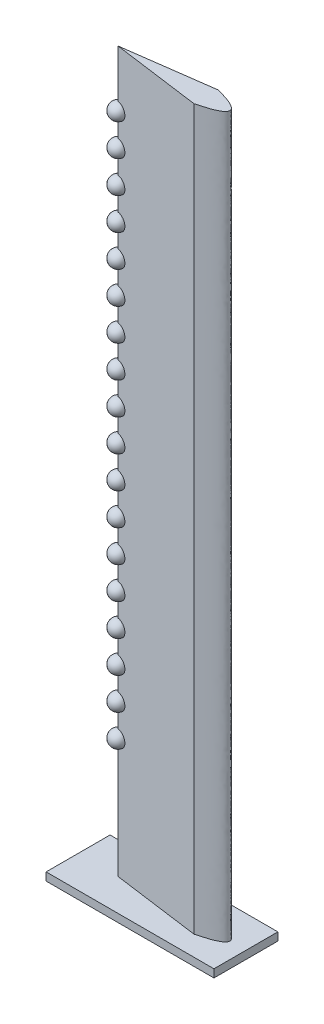
ISO-10303-21;
HEADER;
FILE_DESCRIPTION(('STEP AP214'),'2;1');
FILE_NAME('part.step','',(''),(''),'','','');
FILE_SCHEMA(('AUTOMOTIVE_DESIGN { 1 0 10303 214 1 1 1 1 }'));
ENDSEC;
DATA;
#1=APPLICATION_CONTEXT('core data for automotive mechanical design processes');
#2=APPLICATION_PROTOCOL_DEFINITION('international standard','automotive_design',2000,#1);
#3=PRODUCT_CONTEXT('',#1,'mechanical');
#4=PRODUCT('Part','Part','',(#3));
#5=PRODUCT_RELATED_PRODUCT_CATEGORY('part','',(#4));
#6=PRODUCT_DEFINITION_FORMATION('','',#4);
#7=PRODUCT_DEFINITION_CONTEXT('part definition',#1,'design');
#8=PRODUCT_DEFINITION('design','',#6,#7);
#9=PRODUCT_DEFINITION_SHAPE('','',#8);
#10=(LENGTH_UNIT() NAMED_UNIT(*) SI_UNIT(.MILLI.,.METRE.));
#11=(NAMED_UNIT(*) PLANE_ANGLE_UNIT() SI_UNIT($,.RADIAN.));
#12=(NAMED_UNIT(*) SI_UNIT($,.STERADIAN.) SOLID_ANGLE_UNIT());
#13=UNCERTAINTY_MEASURE_WITH_UNIT(LENGTH_MEASURE(1.E-05),#10,'distance_accuracy_value','');
#14=(GEOMETRIC_REPRESENTATION_CONTEXT(3) GLOBAL_UNCERTAINTY_ASSIGNED_CONTEXT((#13)) GLOBAL_UNIT_ASSIGNED_CONTEXT((#10,
#11,#12)) REPRESENTATION_CONTEXT('',''));
#15=CARTESIAN_POINT('',(0.,0.,0.));
#16=DIRECTION('',(0.,0.,1.));
#17=DIRECTION('',(1.,0.,0.));
#18=AXIS2_PLACEMENT_3D('',#15,#16,#17);
#19=CARTESIAN_POINT('',(110.,900.,15.));
#20=DIRECTION('',(0.135113204733314,0.,-0.990830168044299));
#21=DIRECTION('',(-0.990830168044299,0.,-0.135113204733313));
#22=AXIS2_PLACEMENT_3D('',#19,#20,#21);
#23=PLANE('',#22);
#24=DIRECTION('',(0.,-1.,0.));
#25=VECTOR('',#24,1.);
#26=CARTESIAN_POINT('',(0.,900.,0.));
#27=LINE('',#26,#25);
#28=CARTESIAN_POINT('',(0.,900.,0.));
#29=VERTEX_POINT('',#28);
#30=CARTESIAN_POINT('',(0.,840.,0.));
#31=VERTEX_POINT('',#30);
#32=EDGE_CURVE('E216',#29,#31,#27,.T.);
#33=ORIENTED_EDGE('',*,*,#32,.T.);
#34=CARTESIAN_POINT('',(0.,830.,0.));
#35=DIRECTION('',(0.135113204733314,0.,-0.990830168044299));
#36=DIRECTION('',(-0.990830168044299,0.,-0.135113204733313));
#37=AXIS2_PLACEMENT_3D('',#34,#35,#36);
#38=CIRCLE('',#37,10.);
#39=CARTESIAN_POINT('',(0.,820.,0.));
#40=VERTEX_POINT('',#39);
#41=EDGE_CURVE('E61',#31,#40,#38,.T.);
#42=ORIENTED_EDGE('',*,*,#41,.T.);
#43=CARTESIAN_POINT('',(0.,800.,0.));
#44=VERTEX_POINT('',#43);
#45=EDGE_CURVE('E67',#40,#44,#27,.T.);
#46=ORIENTED_EDGE('',*,*,#45,.T.);
#47=CARTESIAN_POINT('',(0.,790.,0.));
#48=DIRECTION('',(0.135113204733314,0.,-0.990830168044299));
#49=DIRECTION('',(-0.990830168044299,0.,-0.135113204733313));
#50=AXIS2_PLACEMENT_3D('',#47,#48,#49);
#51=CIRCLE('',#50,10.);
#52=CARTESIAN_POINT('',(0.,780.,0.));
#53=VERTEX_POINT('',#52);
#54=EDGE_CURVE('E218',#44,#53,#51,.T.);
#55=ORIENTED_EDGE('',*,*,#54,.T.);
#56=CARTESIAN_POINT('',(0.,760.,0.));
#57=VERTEX_POINT('',#56);
#58=EDGE_CURVE('E224',#53,#57,#27,.T.);
#59=ORIENTED_EDGE('',*,*,#58,.T.);
#60=CARTESIAN_POINT('',(0.,750.,0.));
#61=DIRECTION('',(0.135113204733314,0.,-0.990830168044299));
#62=DIRECTION('',(-0.990830168044299,0.,-0.135113204733313));
#63=AXIS2_PLACEMENT_3D('',#60,#61,#62);
#64=CIRCLE('',#63,10.);
#65=CARTESIAN_POINT('',(0.,740.,0.));
#66=VERTEX_POINT('',#65);
#67=EDGE_CURVE('E311',#57,#66,#64,.T.);
#68=ORIENTED_EDGE('',*,*,#67,.T.);
#69=CARTESIAN_POINT('',(0.,720.,0.));
#70=VERTEX_POINT('',#69);
#71=EDGE_CURVE('E230',#66,#70,#27,.T.);
#72=ORIENTED_EDGE('',*,*,#71,.T.);
#73=CARTESIAN_POINT('',(0.,710.,0.));
#74=DIRECTION('',(0.135113204733314,0.,-0.990830168044299));
#75=DIRECTION('',(-0.990830168044299,0.,-0.135113204733313));
#76=AXIS2_PLACEMENT_3D('',#73,#74,#75);
#77=CIRCLE('',#76,10.);
#78=CARTESIAN_POINT('',(0.,700.,0.));
#79=VERTEX_POINT('',#78);
#80=EDGE_CURVE('E315',#70,#79,#77,.T.);
#81=ORIENTED_EDGE('',*,*,#80,.T.);
#82=CARTESIAN_POINT('',(0.,680.,0.));
#83=VERTEX_POINT('',#82);
#84=EDGE_CURVE('E707',#79,#83,#27,.T.);
#85=ORIENTED_EDGE('',*,*,#84,.T.);
#86=CARTESIAN_POINT('',(0.,670.,0.));
#87=DIRECTION('',(0.135113204733314,0.,-0.990830168044299));
#88=DIRECTION('',(-0.990830168044299,0.,-0.135113204733313));
#89=AXIS2_PLACEMENT_3D('',#86,#87,#88);
#90=CIRCLE('',#89,10.);
#91=CARTESIAN_POINT('',(0.,660.,0.));
#92=VERTEX_POINT('',#91);
#93=EDGE_CURVE('E319',#83,#92,#90,.T.);
#94=ORIENTED_EDGE('',*,*,#93,.T.);
#95=CARTESIAN_POINT('',(0.,640.,0.));
#96=VERTEX_POINT('',#95);
#97=EDGE_CURVE('E711',#92,#96,#27,.T.);
#98=ORIENTED_EDGE('',*,*,#97,.T.);
#99=CARTESIAN_POINT('',(0.,630.,0.));
#100=DIRECTION('',(0.135113204733314,0.,-0.990830168044299));
#101=DIRECTION('',(-0.990830168044299,0.,-0.135113204733313));
#102=AXIS2_PLACEMENT_3D('',#99,#100,#101);
#103=CIRCLE('',#102,10.);
#104=CARTESIAN_POINT('',(0.,620.,0.));
#105=VERTEX_POINT('',#104);
#106=EDGE_CURVE('E326',#96,#105,#103,.T.);
#107=ORIENTED_EDGE('',*,*,#106,.T.);
#108=CARTESIAN_POINT('',(0.,600.,0.));
#109=VERTEX_POINT('',#108);
#110=EDGE_CURVE('E714',#105,#109,#27,.T.);
#111=ORIENTED_EDGE('',*,*,#110,.T.);
#112=CARTESIAN_POINT('',(0.,590.,0.));
#113=DIRECTION('',(0.135113204733314,0.,-0.990830168044299));
#114=DIRECTION('',(-0.990830168044299,0.,-0.135113204733313));
#115=AXIS2_PLACEMENT_3D('',#112,#113,#114);
#116=CIRCLE('',#115,10.);
#117=CARTESIAN_POINT('',(0.,580.,0.));
#118=VERTEX_POINT('',#117);
#119=EDGE_CURVE('E330',#109,#118,#116,.T.);
#120=ORIENTED_EDGE('',*,*,#119,.T.);
#121=CARTESIAN_POINT('',(0.,560.,0.));
#122=VERTEX_POINT('',#121);
#123=EDGE_CURVE('E717',#118,#122,#27,.T.);
#124=ORIENTED_EDGE('',*,*,#123,.T.);
#125=CARTESIAN_POINT('',(0.,550.,0.));
#126=DIRECTION('',(0.135113204733314,0.,-0.990830168044299));
#127=DIRECTION('',(-0.990830168044299,0.,-0.135113204733313));
#128=AXIS2_PLACEMENT_3D('',#125,#126,#127);
#129=CIRCLE('',#128,10.);
#130=CARTESIAN_POINT('',(0.,540.,0.));
#131=VERTEX_POINT('',#130);
#132=EDGE_CURVE('E334',#122,#131,#129,.T.);
#133=ORIENTED_EDGE('',*,*,#132,.T.);
#134=CARTESIAN_POINT('',(0.,520.,0.));
#135=VERTEX_POINT('',#134);
#136=EDGE_CURVE('E721',#131,#135,#27,.T.);
#137=ORIENTED_EDGE('',*,*,#136,.T.);
#138=CARTESIAN_POINT('',(0.,510.,0.));
#139=DIRECTION('',(0.135113204733314,0.,-0.990830168044299));
#140=DIRECTION('',(-0.990830168044299,0.,-0.135113204733313));
#141=AXIS2_PLACEMENT_3D('',#138,#139,#140);
#142=CIRCLE('',#141,10.);
#143=CARTESIAN_POINT('',(0.,500.,0.));
#144=VERTEX_POINT('',#143);
#145=EDGE_CURVE('E338',#135,#144,#142,.T.);
#146=ORIENTED_EDGE('',*,*,#145,.T.);
#147=CARTESIAN_POINT('',(0.,480.,0.));
#148=VERTEX_POINT('',#147);
#149=EDGE_CURVE('E725',#144,#148,#27,.T.);
#150=ORIENTED_EDGE('',*,*,#149,.T.);
#151=CARTESIAN_POINT('',(0.,470.,0.));
#152=DIRECTION('',(0.135113204733314,0.,-0.990830168044299));
#153=DIRECTION('',(-0.990830168044299,0.,-0.135113204733313));
#154=AXIS2_PLACEMENT_3D('',#151,#152,#153);
#155=CIRCLE('',#154,10.);
#156=CARTESIAN_POINT('',(0.,460.,0.));
#157=VERTEX_POINT('',#156);
#158=EDGE_CURVE('E342',#148,#157,#155,.T.);
#159=ORIENTED_EDGE('',*,*,#158,.T.);
#160=CARTESIAN_POINT('',(0.,440.,0.));
#161=VERTEX_POINT('',#160);
#162=EDGE_CURVE('E729',#157,#161,#27,.T.);
#163=ORIENTED_EDGE('',*,*,#162,.T.);
#164=CARTESIAN_POINT('',(0.,430.,0.));
#165=DIRECTION('',(0.135113204733314,0.,-0.990830168044299));
#166=DIRECTION('',(-0.990830168044299,0.,-0.135113204733313));
#167=AXIS2_PLACEMENT_3D('',#164,#165,#166);
#168=CIRCLE('',#167,10.);
#169=CARTESIAN_POINT('',(0.,420.,0.));
#170=VERTEX_POINT('',#169);
#171=EDGE_CURVE('E346',#161,#170,#168,.T.);
#172=ORIENTED_EDGE('',*,*,#171,.T.);
#173=CARTESIAN_POINT('',(0.,400.,0.));
#174=VERTEX_POINT('',#173);
#175=EDGE_CURVE('E733',#170,#174,#27,.T.);
#176=ORIENTED_EDGE('',*,*,#175,.T.);
#177=CARTESIAN_POINT('',(0.,390.,0.));
#178=DIRECTION('',(0.135113204733314,0.,-0.990830168044299));
#179=DIRECTION('',(-0.990830168044299,0.,-0.135113204733313));
#180=AXIS2_PLACEMENT_3D('',#177,#178,#179);
#181=CIRCLE('',#180,10.);
#182=CARTESIAN_POINT('',(0.,380.,0.));
#183=VERTEX_POINT('',#182);
#184=EDGE_CURVE('E350',#174,#183,#181,.T.);
#185=ORIENTED_EDGE('',*,*,#184,.T.);
#186=CARTESIAN_POINT('',(0.,360.,0.));
#187=VERTEX_POINT('',#186);
#188=EDGE_CURVE('E737',#183,#187,#27,.T.);
#189=ORIENTED_EDGE('',*,*,#188,.T.);
#190=CARTESIAN_POINT('',(0.,350.,0.));
#191=DIRECTION('',(0.135113204733314,0.,-0.990830168044299));
#192=DIRECTION('',(-0.990830168044299,0.,-0.135113204733313));
#193=AXIS2_PLACEMENT_3D('',#190,#191,#192);
#194=CIRCLE('',#193,10.);
#195=CARTESIAN_POINT('',(0.,340.,0.));
#196=VERTEX_POINT('',#195);
#197=EDGE_CURVE('E354',#187,#196,#194,.T.);
#198=ORIENTED_EDGE('',*,*,#197,.T.);
#199=CARTESIAN_POINT('',(0.,320.,0.));
#200=VERTEX_POINT('',#199);
#201=EDGE_CURVE('E741',#196,#200,#27,.T.);
#202=ORIENTED_EDGE('',*,*,#201,.T.);
#203=CARTESIAN_POINT('',(0.,310.,0.));
#204=DIRECTION('',(0.135113204733314,0.,-0.990830168044299));
#205=DIRECTION('',(-0.990830168044299,0.,-0.135113204733313));
#206=AXIS2_PLACEMENT_3D('',#203,#204,#205);
#207=CIRCLE('',#206,10.);
#208=CARTESIAN_POINT('',(0.,300.,0.));
#209=VERTEX_POINT('',#208);
#210=EDGE_CURVE('E358',#200,#209,#207,.T.);
#211=ORIENTED_EDGE('',*,*,#210,.T.);
#212=CARTESIAN_POINT('',(0.,280.,0.));
#213=VERTEX_POINT('',#212);
#214=EDGE_CURVE('E745',#209,#213,#27,.T.);
#215=ORIENTED_EDGE('',*,*,#214,.T.);
#216=CARTESIAN_POINT('',(0.,270.,0.));
#217=DIRECTION('',(0.135113204733314,0.,-0.990830168044299));
#218=DIRECTION('',(-0.990830168044299,0.,-0.135113204733313));
#219=AXIS2_PLACEMENT_3D('',#216,#217,#218);
#220=CIRCLE('',#219,10.);
#221=CARTESIAN_POINT('',(0.,260.,0.));
#222=VERTEX_POINT('',#221);
#223=EDGE_CURVE('E362',#213,#222,#220,.T.);
#224=ORIENTED_EDGE('',*,*,#223,.T.);
#225=CARTESIAN_POINT('',(0.,240.,0.));
#226=VERTEX_POINT('',#225);
#227=EDGE_CURVE('E749',#222,#226,#27,.T.);
#228=ORIENTED_EDGE('',*,*,#227,.T.);
#229=CARTESIAN_POINT('',(0.,230.,0.));
#230=DIRECTION('',(0.135113204733314,0.,-0.990830168044299));
#231=DIRECTION('',(-0.990830168044299,0.,-0.135113204733313));
#232=AXIS2_PLACEMENT_3D('',#229,#230,#231);
#233=CIRCLE('',#232,10.);
#234=CARTESIAN_POINT('',(0.,220.,0.));
#235=VERTEX_POINT('',#234);
#236=EDGE_CURVE('E366',#226,#235,#233,.T.);
#237=ORIENTED_EDGE('',*,*,#236,.T.);
#238=CARTESIAN_POINT('',(0.,200.,0.));
#239=VERTEX_POINT('',#238);
#240=EDGE_CURVE('E753',#235,#239,#27,.T.);
#241=ORIENTED_EDGE('',*,*,#240,.T.);
#242=CARTESIAN_POINT('',(0.,190.,0.));
#243=DIRECTION('',(0.135113204733314,0.,-0.990830168044299));
#244=DIRECTION('',(-0.990830168044299,0.,-0.135113204733313));
#245=AXIS2_PLACEMENT_3D('',#242,#243,#244);
#246=CIRCLE('',#245,10.);
#247=CARTESIAN_POINT('',(0.,180.,0.));
#248=VERTEX_POINT('',#247);
#249=EDGE_CURVE('E370',#239,#248,#246,.T.);
#250=ORIENTED_EDGE('',*,*,#249,.T.);
#251=CARTESIAN_POINT('',(0.,160.,0.));
#252=VERTEX_POINT('',#251);
#253=EDGE_CURVE('E757',#248,#252,#27,.T.);
#254=ORIENTED_EDGE('',*,*,#253,.T.);
#255=CARTESIAN_POINT('',(0.,150.,0.));
#256=DIRECTION('',(0.135113204733314,0.,-0.990830168044299));
#257=DIRECTION('',(-0.990830168044299,0.,-0.135113204733313));
#258=AXIS2_PLACEMENT_3D('',#255,#256,#257);
#259=CIRCLE('',#258,10.);
#260=CARTESIAN_POINT('',(0.,140.,0.));
#261=VERTEX_POINT('',#260);
#262=EDGE_CURVE('E374',#252,#261,#259,.T.);
#263=ORIENTED_EDGE('',*,*,#262,.T.);
#264=CARTESIAN_POINT('',(0.,0.,0.));
#265=VERTEX_POINT('',#264);
#266=EDGE_CURVE('E229',#261,#265,#27,.T.);
#267=ORIENTED_EDGE('',*,*,#266,.T.);
#268=DIRECTION('',(0.990830168044299,0.,0.135113204733313));
#269=VECTOR('',#268,1.);
#270=CARTESIAN_POINT('',(110.,0.,15.));
#271=LINE('',#270,#269);
#272=CARTESIAN_POINT('',(110.,0.,15.));
#273=VERTEX_POINT('',#272);
#274=EDGE_CURVE('E420',#265,#273,#271,.T.);
#275=ORIENTED_EDGE('',*,*,#274,.T.);
#276=DIRECTION('',(0.,-1.,0.));
#277=VECTOR('',#276,1.);
#278=CARTESIAN_POINT('',(110.,900.,15.));
#279=LINE('',#278,#277);
#280=CARTESIAN_POINT('',(110.,900.,15.));
#281=VERTEX_POINT('',#280);
#282=EDGE_CURVE('E238',#281,#273,#279,.T.);
#283=ORIENTED_EDGE('',*,*,#282,.F.);
#284=DIRECTION('',(0.990830168044299,0.,0.135113204733313));
#285=VECTOR('',#284,1.);
#286=CARTESIAN_POINT('',(110.,900.,15.));
#287=LINE('',#286,#285);
#288=EDGE_CURVE('E421',#29,#281,#287,.T.);
#289=ORIENTED_EDGE('',*,*,#288,.F.);
#290=EDGE_LOOP('',(#33,#42,#46,#55,#59,#68,#72,#81,#85,#94,#98,#107,#111,#120,#124,#133,#137,
#146,#150,#159,#163,#172,#176,#185,#189,#198,#202,#211,#215,#224,#228,#237,#241,#250,#254,#263,
#267,#275,#283,#289));
#291=FACE_BOUND('',#290,.T.);
#292=ADVANCED_FACE('F47',(#291),#23,.F.);
#293=CARTESIAN_POINT('',(110.,900.,15.));
#294=CARTESIAN_POINT('',(170.,900.,0.));
#295=CARTESIAN_POINT('',(110.,900.,-15.));
#296=B_SPLINE_CURVE_WITH_KNOTS('',2,(#293,#294,#295),.UNSPECIFIED.,.F.,.F.,(3,3),(0.,1.),.UNSPECIFIED.);
#297=DIRECTION('',(0.,-1.,0.));
#298=VECTOR('',#297,1.);
#299=SURFACE_OF_LINEAR_EXTRUSION('',#296,#298);
#300=CARTESIAN_POINT('',(110.,0.,15.));
#301=CARTESIAN_POINT('',(170.,0.,0.));
#302=CARTESIAN_POINT('',(110.,0.,-15.));
#303=B_SPLINE_CURVE_WITH_KNOTS('',2,(#300,#301,#302),.UNSPECIFIED.,.F.,.F.,(3,3),(0.,1.),.UNSPECIFIED.);
#304=CARTESIAN_POINT('',(110.,0.,-15.));
#305=VERTEX_POINT('',#304);
#306=EDGE_CURVE('E772',#273,#305,#303,.T.);
#307=ORIENTED_EDGE('',*,*,#306,.T.);
#308=DIRECTION('',(0.,-1.,0.));
#309=VECTOR('',#308,1.);
#310=CARTESIAN_POINT('',(110.,900.,-15.));
#311=LINE('',#310,#309);
#312=CARTESIAN_POINT('',(110.,900.,-15.));
#313=VERTEX_POINT('',#312);
#314=EDGE_CURVE('E228',#313,#305,#311,.T.);
#315=ORIENTED_EDGE('',*,*,#314,.F.);
#316=EDGE_CURVE('E425',#281,#313,#296,.T.);
#317=ORIENTED_EDGE('',*,*,#316,.F.);
#318=ORIENTED_EDGE('',*,*,#282,.T.);
#319=EDGE_LOOP('',(#307,#315,#317,#318));
#320=FACE_BOUND('',#319,.T.);
#321=ADVANCED_FACE('F436',(#320),#299,.F.);
#322=CARTESIAN_POINT('',(0.,900.,0.));
#323=DIRECTION('',(0.135113204733314,0.,0.990830168044299));
#324=DIRECTION('',(0.990830168044299,0.,-0.135113204733313));
#325=AXIS2_PLACEMENT_3D('',#322,#323,#324);
#326=PLANE('',#325);
#327=ORIENTED_EDGE('',*,*,#45,.F.);
#328=CARTESIAN_POINT('',(0.,830.,0.));
#329=DIRECTION('',(0.135113204733314,0.,0.990830168044299));
#330=DIRECTION('',(0.990830168044299,0.,-0.135113204733313));
#331=AXIS2_PLACEMENT_3D('',#328,#329,#330);
#332=CIRCLE('',#331,10.);
#333=EDGE_CURVE('E11',#40,#31,#332,.T.);
#334=ORIENTED_EDGE('',*,*,#333,.T.);
#335=ORIENTED_EDGE('',*,*,#32,.F.);
#336=DIRECTION('',(-0.990830168044299,0.,0.135113204733313));
#337=VECTOR('',#336,1.);
#338=CARTESIAN_POINT('',(0.,900.,0.));
#339=LINE('',#338,#337);
#340=EDGE_CURVE('E431',#313,#29,#339,.T.);
#341=ORIENTED_EDGE('',*,*,#340,.F.);
#342=ORIENTED_EDGE('',*,*,#314,.T.);
#343=DIRECTION('',(-0.990830168044299,0.,0.135113204733313));
#344=VECTOR('',#343,1.);
#345=CARTESIAN_POINT('',(0.,0.,0.));
#346=LINE('',#345,#344);
#347=EDGE_CURVE('E233',#305,#265,#346,.T.);
#348=ORIENTED_EDGE('',*,*,#347,.T.);
#349=ORIENTED_EDGE('',*,*,#266,.F.);
#350=CARTESIAN_POINT('',(0.,150.,0.));
#351=DIRECTION('',(0.135113204733314,0.,0.990830168044299));
#352=DIRECTION('',(0.990830168044299,0.,-0.135113204733313));
#353=AXIS2_PLACEMENT_3D('',#350,#351,#352);
#354=CIRCLE('',#353,10.);
#355=EDGE_CURVE('E242',#261,#252,#354,.T.);
#356=ORIENTED_EDGE('',*,*,#355,.T.);
#357=ORIENTED_EDGE('',*,*,#253,.F.);
#358=CARTESIAN_POINT('',(0.,190.,0.));
#359=DIRECTION('',(0.135113204733314,0.,0.990830168044299));
#360=DIRECTION('',(0.990830168044299,0.,-0.135113204733313));
#361=AXIS2_PLACEMENT_3D('',#358,#359,#360);
#362=CIRCLE('',#361,10.);
#363=EDGE_CURVE('E246',#248,#239,#362,.T.);
#364=ORIENTED_EDGE('',*,*,#363,.T.);
#365=ORIENTED_EDGE('',*,*,#240,.F.);
#366=CARTESIAN_POINT('',(0.,230.,0.));
#367=DIRECTION('',(0.135113204733314,0.,0.990830168044299));
#368=DIRECTION('',(0.990830168044299,0.,-0.135113204733313));
#369=AXIS2_PLACEMENT_3D('',#366,#367,#368);
#370=CIRCLE('',#369,10.);
#371=EDGE_CURVE('E250',#235,#226,#370,.T.);
#372=ORIENTED_EDGE('',*,*,#371,.T.);
#373=ORIENTED_EDGE('',*,*,#227,.F.);
#374=CARTESIAN_POINT('',(0.,270.,0.));
#375=DIRECTION('',(0.135113204733314,0.,0.990830168044299));
#376=DIRECTION('',(0.990830168044299,0.,-0.135113204733313));
#377=AXIS2_PLACEMENT_3D('',#374,#375,#376);
#378=CIRCLE('',#377,10.);
#379=EDGE_CURVE('E254',#222,#213,#378,.T.);
#380=ORIENTED_EDGE('',*,*,#379,.T.);
#381=ORIENTED_EDGE('',*,*,#214,.F.);
#382=CARTESIAN_POINT('',(0.,310.,0.));
#383=DIRECTION('',(0.135113204733314,0.,0.990830168044299));
#384=DIRECTION('',(0.990830168044299,0.,-0.135113204733313));
#385=AXIS2_PLACEMENT_3D('',#382,#383,#384);
#386=CIRCLE('',#385,10.);
#387=EDGE_CURVE('E258',#209,#200,#386,.T.);
#388=ORIENTED_EDGE('',*,*,#387,.T.);
#389=ORIENTED_EDGE('',*,*,#201,.F.);
#390=CARTESIAN_POINT('',(0.,350.,0.));
#391=DIRECTION('',(0.135113204733314,0.,0.990830168044299));
#392=DIRECTION('',(0.990830168044299,0.,-0.135113204733313));
#393=AXIS2_PLACEMENT_3D('',#390,#391,#392);
#394=CIRCLE('',#393,10.);
#395=EDGE_CURVE('E262',#196,#187,#394,.T.);
#396=ORIENTED_EDGE('',*,*,#395,.T.);
#397=ORIENTED_EDGE('',*,*,#188,.F.);
#398=CARTESIAN_POINT('',(0.,390.,0.));
#399=DIRECTION('',(0.135113204733314,0.,0.990830168044299));
#400=DIRECTION('',(0.990830168044299,0.,-0.135113204733313));
#401=AXIS2_PLACEMENT_3D('',#398,#399,#400);
#402=CIRCLE('',#401,10.);
#403=EDGE_CURVE('E266',#183,#174,#402,.T.);
#404=ORIENTED_EDGE('',*,*,#403,.T.);
#405=ORIENTED_EDGE('',*,*,#175,.F.);
#406=CARTESIAN_POINT('',(0.,430.,0.));
#407=DIRECTION('',(0.135113204733314,0.,0.990830168044299));
#408=DIRECTION('',(0.990830168044299,0.,-0.135113204733313));
#409=AXIS2_PLACEMENT_3D('',#406,#407,#408);
#410=CIRCLE('',#409,10.);
#411=EDGE_CURVE('E270',#170,#161,#410,.T.);
#412=ORIENTED_EDGE('',*,*,#411,.T.);
#413=ORIENTED_EDGE('',*,*,#162,.F.);
#414=CARTESIAN_POINT('',(0.,470.,0.));
#415=DIRECTION('',(0.135113204733314,0.,0.990830168044299));
#416=DIRECTION('',(0.990830168044299,0.,-0.135113204733313));
#417=AXIS2_PLACEMENT_3D('',#414,#415,#416);
#418=CIRCLE('',#417,10.);
#419=EDGE_CURVE('E274',#157,#148,#418,.T.);
#420=ORIENTED_EDGE('',*,*,#419,.T.);
#421=ORIENTED_EDGE('',*,*,#149,.F.);
#422=CARTESIAN_POINT('',(0.,510.,0.));
#423=DIRECTION('',(0.135113204733314,0.,0.990830168044299));
#424=DIRECTION('',(0.990830168044299,0.,-0.135113204733313));
#425=AXIS2_PLACEMENT_3D('',#422,#423,#424);
#426=CIRCLE('',#425,10.);
#427=EDGE_CURVE('E278',#144,#135,#426,.T.);
#428=ORIENTED_EDGE('',*,*,#427,.T.);
#429=ORIENTED_EDGE('',*,*,#136,.F.);
#430=CARTESIAN_POINT('',(0.,550.,0.));
#431=DIRECTION('',(0.135113204733314,0.,0.990830168044299));
#432=DIRECTION('',(0.990830168044299,0.,-0.135113204733313));
#433=AXIS2_PLACEMENT_3D('',#430,#431,#432);
#434=CIRCLE('',#433,10.);
#435=EDGE_CURVE('E282',#131,#122,#434,.T.);
#436=ORIENTED_EDGE('',*,*,#435,.T.);
#437=ORIENTED_EDGE('',*,*,#123,.F.);
#438=CARTESIAN_POINT('',(0.,590.,0.));
#439=DIRECTION('',(0.135113204733314,0.,0.990830168044299));
#440=DIRECTION('',(0.990830168044299,0.,-0.135113204733313));
#441=AXIS2_PLACEMENT_3D('',#438,#439,#440);
#442=CIRCLE('',#441,10.);
#443=EDGE_CURVE('E286',#118,#109,#442,.T.);
#444=ORIENTED_EDGE('',*,*,#443,.T.);
#445=ORIENTED_EDGE('',*,*,#110,.F.);
#446=CARTESIAN_POINT('',(0.,630.,0.));
#447=DIRECTION('',(0.135113204733314,0.,0.990830168044299));
#448=DIRECTION('',(0.990830168044299,0.,-0.135113204733313));
#449=AXIS2_PLACEMENT_3D('',#446,#447,#448);
#450=CIRCLE('',#449,10.);
#451=EDGE_CURVE('E290',#105,#96,#450,.T.);
#452=ORIENTED_EDGE('',*,*,#451,.T.);
#453=ORIENTED_EDGE('',*,*,#97,.F.);
#454=CARTESIAN_POINT('',(0.,670.,0.));
#455=DIRECTION('',(0.135113204733314,0.,0.990830168044299));
#456=DIRECTION('',(0.990830168044299,0.,-0.135113204733313));
#457=AXIS2_PLACEMENT_3D('',#454,#455,#456);
#458=CIRCLE('',#457,10.);
#459=EDGE_CURVE('E294',#92,#83,#458,.T.);
#460=ORIENTED_EDGE('',*,*,#459,.T.);
#461=ORIENTED_EDGE('',*,*,#84,.F.);
#462=CARTESIAN_POINT('',(0.,710.,0.));
#463=DIRECTION('',(0.135113204733314,0.,0.990830168044299));
#464=DIRECTION('',(0.990830168044299,0.,-0.135113204733313));
#465=AXIS2_PLACEMENT_3D('',#462,#463,#464);
#466=CIRCLE('',#465,10.);
#467=EDGE_CURVE('E298',#79,#70,#466,.T.);
#468=ORIENTED_EDGE('',*,*,#467,.T.);
#469=ORIENTED_EDGE('',*,*,#71,.F.);
#470=CARTESIAN_POINT('',(0.,750.,0.));
#471=DIRECTION('',(0.135113204733314,0.,0.990830168044299));
#472=DIRECTION('',(0.990830168044299,0.,-0.135113204733313));
#473=AXIS2_PLACEMENT_3D('',#470,#471,#472);
#474=CIRCLE('',#473,10.);
#475=EDGE_CURVE('E302',#66,#57,#474,.T.);
#476=ORIENTED_EDGE('',*,*,#475,.T.);
#477=ORIENTED_EDGE('',*,*,#58,.F.);
#478=CARTESIAN_POINT('',(0.,790.,0.));
#479=DIRECTION('',(0.135113204733314,0.,0.990830168044299));
#480=DIRECTION('',(0.990830168044299,0.,-0.135113204733313));
#481=AXIS2_PLACEMENT_3D('',#478,#479,#480);
#482=CIRCLE('',#481,10.);
#483=EDGE_CURVE('E55',#53,#44,#482,.T.);
#484=ORIENTED_EDGE('',*,*,#483,.T.);
#485=EDGE_LOOP('',(#327,#334,#335,#341,#342,#348,#349,#356,#357,#364,#365,#372,#373,#380,#381,
#388,#389,#396,#397,#404,#405,#412,#413,#420,#421,#428,#429,#436,#437,#444,#445,#452,#453,#460,
#461,#468,#469,#476,#477,#484));
#486=FACE_BOUND('',#485,.T.);
#487=ADVANCED_FACE('F221',(#486),#326,.F.);
#488=CARTESIAN_POINT('',(140.,900.,0.));
#489=DIRECTION('',(0.,1.,0.));
#490=DIRECTION('',(0.,0.,1.));
#491=AXIS2_PLACEMENT_3D('',#488,#489,#490);
#492=PLANE('',#491);
#493=ORIENTED_EDGE('',*,*,#288,.T.);
#494=ORIENTED_EDGE('',*,*,#316,.T.);
#495=ORIENTED_EDGE('',*,*,#340,.T.);
#496=EDGE_LOOP('',(#493,#494,#495));
#497=FACE_BOUND('',#496,.T.);
#498=ADVANCED_FACE('F442',(#497),#492,.T.);
#499=CARTESIAN_POINT('',(-50.,-10.,40.));
#500=DIRECTION('',(1.,0.,0.));
#501=DIRECTION('',(0.,0.,-1.));
#502=AXIS2_PLACEMENT_3D('',#499,#500,#501);
#503=PLANE('',#502);
#504=DIRECTION('',(0.,0.,-1.));
#505=VECTOR('',#504,1.);
#506=CARTESIAN_POINT('',(-50.,0.,40.));
#507=LINE('',#506,#505);
#508=CARTESIAN_POINT('',(-50.,0.,40.));
#509=VERTEX_POINT('',#508);
#510=CARTESIAN_POINT('',(-50.,0.,-40.));
#511=VERTEX_POINT('',#510);
#512=EDGE_CURVE('E378',#509,#511,#507,.T.);
#513=ORIENTED_EDGE('',*,*,#512,.T.);
#514=DIRECTION('',(0.,1.,0.));
#515=VECTOR('',#514,1.);
#516=CARTESIAN_POINT('',(-50.,-10.,-40.));
#517=LINE('',#516,#515);
#518=CARTESIAN_POINT('',(-50.,-10.,-40.));
#519=VERTEX_POINT('',#518);
#520=EDGE_CURVE('E416',#519,#511,#517,.T.);
#521=ORIENTED_EDGE('',*,*,#520,.F.);
#522=DIRECTION('',(0.,0.,-1.));
#523=VECTOR('',#522,1.);
#524=CARTESIAN_POINT('',(-50.,-10.,40.));
#525=LINE('',#524,#523);
#526=CARTESIAN_POINT('',(-50.,-10.,40.));
#527=VERTEX_POINT('',#526);
#528=EDGE_CURVE('E379',#527,#519,#525,.T.);
#529=ORIENTED_EDGE('',*,*,#528,.F.);
#530=DIRECTION('',(0.,1.,0.));
#531=VECTOR('',#530,1.);
#532=CARTESIAN_POINT('',(-50.,-10.,40.));
#533=LINE('',#532,#531);
#534=EDGE_CURVE('E393',#527,#509,#533,.T.);
#535=ORIENTED_EDGE('',*,*,#534,.T.);
#536=EDGE_LOOP('',(#513,#521,#529,#535));
#537=FACE_BOUND('',#536,.T.);
#538=ADVANCED_FACE('F445',(#537),#503,.F.);
#539=CARTESIAN_POINT('',(-50.,-10.,-40.));
#540=DIRECTION('',(0.,0.,1.));
#541=DIRECTION('',(1.,0.,0.));
#542=AXIS2_PLACEMENT_3D('',#539,#540,#541);
#543=PLANE('',#542);
#544=DIRECTION('',(1.,0.,0.));
#545=VECTOR('',#544,1.);
#546=CARTESIAN_POINT('',(-50.,0.,-40.));
#547=LINE('',#546,#545);
#548=CARTESIAN_POINT('',(160.,0.,-40.));
#549=VERTEX_POINT('',#548);
#550=EDGE_CURVE('E397',#511,#549,#547,.T.);
#551=ORIENTED_EDGE('',*,*,#550,.T.);
#552=DIRECTION('',(0.,1.,0.));
#553=VECTOR('',#552,1.);
#554=CARTESIAN_POINT('',(160.,-10.,-40.));
#555=LINE('',#554,#553);
#556=CARTESIAN_POINT('',(160.,-10.,-40.));
#557=VERTEX_POINT('',#556);
#558=EDGE_CURVE('E412',#557,#549,#555,.T.);
#559=ORIENTED_EDGE('',*,*,#558,.F.);
#560=DIRECTION('',(1.,0.,0.));
#561=VECTOR('',#560,1.);
#562=CARTESIAN_POINT('',(-50.,-10.,-40.));
#563=LINE('',#562,#561);
#564=EDGE_CURVE('E383',#519,#557,#563,.T.);
#565=ORIENTED_EDGE('',*,*,#564,.F.);
#566=ORIENTED_EDGE('',*,*,#520,.T.);
#567=EDGE_LOOP('',(#551,#559,#565,#566));
#568=FACE_BOUND('',#567,.T.);
#569=ADVANCED_FACE('F449',(#568),#543,.F.);
#570=CARTESIAN_POINT('',(160.,-10.,40.));
#571=DIRECTION('',(-1.,0.,0.));
#572=DIRECTION('',(0.,0.,1.));
#573=AXIS2_PLACEMENT_3D('',#570,#571,#572);
#574=PLANE('',#573);
#575=DIRECTION('',(0.,0.,1.));
#576=VECTOR('',#575,1.);
#577=CARTESIAN_POINT('',(160.,0.,40.));
#578=LINE('',#577,#576);
#579=CARTESIAN_POINT('',(160.,0.,40.));
#580=VERTEX_POINT('',#579);
#581=EDGE_CURVE('E400',#549,#580,#578,.T.);
#582=ORIENTED_EDGE('',*,*,#581,.T.);
#583=DIRECTION('',(0.,1.,0.));
#584=VECTOR('',#583,1.);
#585=CARTESIAN_POINT('',(160.,-10.,40.));
#586=LINE('',#585,#584);
#587=CARTESIAN_POINT('',(160.,-10.,40.));
#588=VERTEX_POINT('',#587);
#589=EDGE_CURVE('E408',#588,#580,#586,.T.);
#590=ORIENTED_EDGE('',*,*,#589,.F.);
#591=DIRECTION('',(0.,0.,1.));
#592=VECTOR('',#591,1.);
#593=CARTESIAN_POINT('',(160.,-10.,40.));
#594=LINE('',#593,#592);
#595=EDGE_CURVE('E387',#557,#588,#594,.T.);
#596=ORIENTED_EDGE('',*,*,#595,.F.);
#597=ORIENTED_EDGE('',*,*,#558,.T.);
#598=EDGE_LOOP('',(#582,#590,#596,#597));
#599=FACE_BOUND('',#598,.T.);
#600=ADVANCED_FACE('F453',(#599),#574,.F.);
#601=CARTESIAN_POINT('',(-50.,-10.,40.));
#602=DIRECTION('',(0.,0.,-1.));
#603=DIRECTION('',(-1.,0.,0.));
#604=AXIS2_PLACEMENT_3D('',#601,#602,#603);
#605=PLANE('',#604);
#606=DIRECTION('',(-1.,0.,0.));
#607=VECTOR('',#606,1.);
#608=CARTESIAN_POINT('',(-50.,0.,40.));
#609=LINE('',#608,#607);
#610=EDGE_CURVE('E384',#580,#509,#609,.T.);
#611=ORIENTED_EDGE('',*,*,#610,.T.);
#612=ORIENTED_EDGE('',*,*,#534,.F.);
#613=DIRECTION('',(-1.,0.,0.));
#614=VECTOR('',#613,1.);
#615=CARTESIAN_POINT('',(-50.,-10.,40.));
#616=LINE('',#615,#614);
#617=EDGE_CURVE('E390',#588,#527,#616,.T.);
#618=ORIENTED_EDGE('',*,*,#617,.F.);
#619=ORIENTED_EDGE('',*,*,#589,.T.);
#620=EDGE_LOOP('',(#611,#612,#618,#619));
#621=FACE_BOUND('',#620,.T.);
#622=ADVANCED_FACE('F457',(#621),#605,.F.);
#623=CARTESIAN_POINT('',(0.,-10.,0.));
#624=DIRECTION('',(0.,-1.,0.));
#625=DIRECTION('',(0.,0.,-1.));
#626=AXIS2_PLACEMENT_3D('',#623,#624,#625);
#627=PLANE('',#626);
#628=ORIENTED_EDGE('',*,*,#528,.T.);
#629=ORIENTED_EDGE('',*,*,#564,.T.);
#630=ORIENTED_EDGE('',*,*,#595,.T.);
#631=ORIENTED_EDGE('',*,*,#617,.T.);
#632=EDGE_LOOP('',(#628,#629,#630,#631));
#633=FACE_BOUND('',#632,.T.);
#634=ADVANCED_FACE('F461',(#633),#627,.T.);
#635=CARTESIAN_POINT('',(0.,0.,0.));
#636=DIRECTION('',(0.,-1.,0.));
#637=DIRECTION('',(0.,0.,-1.));
#638=AXIS2_PLACEMENT_3D('',#635,#636,#637);
#639=PLANE('',#638);
#640=ORIENTED_EDGE('',*,*,#274,.F.);
#641=ORIENTED_EDGE('',*,*,#347,.F.);
#642=ORIENTED_EDGE('',*,*,#306,.F.);
#643=EDGE_LOOP('',(#640,#641,#642));
#644=FACE_BOUND('',#643,.T.);
#645=ORIENTED_EDGE('',*,*,#512,.F.);
#646=ORIENTED_EDGE('',*,*,#610,.F.);
#647=ORIENTED_EDGE('',*,*,#581,.F.);
#648=ORIENTED_EDGE('',*,*,#550,.F.);
#649=EDGE_LOOP('',(#645,#646,#647,#648));
#650=FACE_BOUND('',#649,.T.);
#651=ADVANCED_FACE('F463',(#644,#650),#639,.F.);
#652=CARTESIAN_POINT('',(0.,150.,0.));
#653=DIRECTION('',(0.,1.,0.));
#654=DIRECTION('',(0.990830168044299,0.,0.135113204733313));
#655=AXIS2_PLACEMENT_3D('',#652,#653,#654);
#656=SPHERICAL_SURFACE('',#655,10.);
#657=ORIENTED_EDGE('',*,*,#262,.F.);
#658=ORIENTED_EDGE('',*,*,#355,.F.);
#659=EDGE_LOOP('',(#657,#658));
#660=FACE_BOUND('',#659,.T.);
#661=ADVANCED_FACE('F466',(#660),#656,.T.);
#662=CARTESIAN_POINT('',(0.,190.,0.));
#663=DIRECTION('',(0.,1.,0.));
#664=DIRECTION('',(0.990830168044299,0.,0.135113204733313));
#665=AXIS2_PLACEMENT_3D('',#662,#663,#664);
#666=SPHERICAL_SURFACE('',#665,10.);
#667=ORIENTED_EDGE('',*,*,#249,.F.);
#668=ORIENTED_EDGE('',*,*,#363,.F.);
#669=EDGE_LOOP('',(#667,#668));
#670=FACE_BOUND('',#669,.T.);
#671=ADVANCED_FACE('F473',(#670),#666,.T.);
#672=CARTESIAN_POINT('',(0.,230.,0.));
#673=DIRECTION('',(0.,1.,0.));
#674=DIRECTION('',(0.990830168044299,0.,0.135113204733313));
#675=AXIS2_PLACEMENT_3D('',#672,#673,#674);
#676=SPHERICAL_SURFACE('',#675,10.);
#677=ORIENTED_EDGE('',*,*,#236,.F.);
#678=ORIENTED_EDGE('',*,*,#371,.F.);
#679=EDGE_LOOP('',(#677,#678));
#680=FACE_BOUND('',#679,.T.);
#681=ADVANCED_FACE('F477',(#680),#676,.T.);
#682=CARTESIAN_POINT('',(0.,270.,0.));
#683=DIRECTION('',(0.,1.,0.));
#684=DIRECTION('',(0.990830168044299,0.,0.135113204733313));
#685=AXIS2_PLACEMENT_3D('',#682,#683,#684);
#686=SPHERICAL_SURFACE('',#685,10.);
#687=ORIENTED_EDGE('',*,*,#223,.F.);
#688=ORIENTED_EDGE('',*,*,#379,.F.);
#689=EDGE_LOOP('',(#687,#688));
#690=FACE_BOUND('',#689,.T.);
#691=ADVANCED_FACE('F481',(#690),#686,.T.);
#692=CARTESIAN_POINT('',(0.,310.,0.));
#693=DIRECTION('',(0.,1.,0.));
#694=DIRECTION('',(0.990830168044299,0.,0.135113204733313));
#695=AXIS2_PLACEMENT_3D('',#692,#693,#694);
#696=SPHERICAL_SURFACE('',#695,10.);
#697=ORIENTED_EDGE('',*,*,#210,.F.);
#698=ORIENTED_EDGE('',*,*,#387,.F.);
#699=EDGE_LOOP('',(#697,#698));
#700=FACE_BOUND('',#699,.T.);
#701=ADVANCED_FACE('F485',(#700),#696,.T.);
#702=CARTESIAN_POINT('',(0.,350.,0.));
#703=DIRECTION('',(0.,1.,0.));
#704=DIRECTION('',(0.990830168044299,0.,0.135113204733313));
#705=AXIS2_PLACEMENT_3D('',#702,#703,#704);
#706=SPHERICAL_SURFACE('',#705,10.);
#707=ORIENTED_EDGE('',*,*,#197,.F.);
#708=ORIENTED_EDGE('',*,*,#395,.F.);
#709=EDGE_LOOP('',(#707,#708));
#710=FACE_BOUND('',#709,.T.);
#711=ADVANCED_FACE('F489',(#710),#706,.T.);
#712=CARTESIAN_POINT('',(0.,390.,0.));
#713=DIRECTION('',(0.,1.,0.));
#714=DIRECTION('',(0.990830168044299,0.,0.135113204733313));
#715=AXIS2_PLACEMENT_3D('',#712,#713,#714);
#716=SPHERICAL_SURFACE('',#715,10.);
#717=ORIENTED_EDGE('',*,*,#184,.F.);
#718=ORIENTED_EDGE('',*,*,#403,.F.);
#719=EDGE_LOOP('',(#717,#718));
#720=FACE_BOUND('',#719,.T.);
#721=ADVANCED_FACE('F493',(#720),#716,.T.);
#722=CARTESIAN_POINT('',(0.,430.,0.));
#723=DIRECTION('',(0.,1.,0.));
#724=DIRECTION('',(0.990830168044299,0.,0.135113204733313));
#725=AXIS2_PLACEMENT_3D('',#722,#723,#724);
#726=SPHERICAL_SURFACE('',#725,10.);
#727=ORIENTED_EDGE('',*,*,#171,.F.);
#728=ORIENTED_EDGE('',*,*,#411,.F.);
#729=EDGE_LOOP('',(#727,#728));
#730=FACE_BOUND('',#729,.T.);
#731=ADVANCED_FACE('F497',(#730),#726,.T.);
#732=CARTESIAN_POINT('',(0.,470.,0.));
#733=DIRECTION('',(0.,1.,0.));
#734=DIRECTION('',(0.990830168044299,0.,0.135113204733313));
#735=AXIS2_PLACEMENT_3D('',#732,#733,#734);
#736=SPHERICAL_SURFACE('',#735,10.);
#737=ORIENTED_EDGE('',*,*,#158,.F.);
#738=ORIENTED_EDGE('',*,*,#419,.F.);
#739=EDGE_LOOP('',(#737,#738));
#740=FACE_BOUND('',#739,.T.);
#741=ADVANCED_FACE('F501',(#740),#736,.T.);
#742=CARTESIAN_POINT('',(0.,510.,0.));
#743=DIRECTION('',(0.,1.,0.));
#744=DIRECTION('',(0.990830168044299,0.,0.135113204733313));
#745=AXIS2_PLACEMENT_3D('',#742,#743,#744);
#746=SPHERICAL_SURFACE('',#745,10.);
#747=ORIENTED_EDGE('',*,*,#145,.F.);
#748=ORIENTED_EDGE('',*,*,#427,.F.);
#749=EDGE_LOOP('',(#747,#748));
#750=FACE_BOUND('',#749,.T.);
#751=ADVANCED_FACE('F505',(#750),#746,.T.);
#752=CARTESIAN_POINT('',(0.,550.,0.));
#753=DIRECTION('',(0.,1.,0.));
#754=DIRECTION('',(0.990830168044299,0.,0.135113204733313));
#755=AXIS2_PLACEMENT_3D('',#752,#753,#754);
#756=SPHERICAL_SURFACE('',#755,10.);
#757=ORIENTED_EDGE('',*,*,#132,.F.);
#758=ORIENTED_EDGE('',*,*,#435,.F.);
#759=EDGE_LOOP('',(#757,#758));
#760=FACE_BOUND('',#759,.T.);
#761=ADVANCED_FACE('F509',(#760),#756,.T.);
#762=CARTESIAN_POINT('',(0.,590.,0.));
#763=DIRECTION('',(0.,1.,0.));
#764=DIRECTION('',(0.990830168044299,0.,0.135113204733313));
#765=AXIS2_PLACEMENT_3D('',#762,#763,#764);
#766=SPHERICAL_SURFACE('',#765,10.);
#767=ORIENTED_EDGE('',*,*,#119,.F.);
#768=ORIENTED_EDGE('',*,*,#443,.F.);
#769=EDGE_LOOP('',(#767,#768));
#770=FACE_BOUND('',#769,.T.);
#771=ADVANCED_FACE('F513',(#770),#766,.T.);
#772=CARTESIAN_POINT('',(0.,630.,0.));
#773=DIRECTION('',(0.,1.,0.));
#774=DIRECTION('',(0.990830168044299,0.,0.135113204733313));
#775=AXIS2_PLACEMENT_3D('',#772,#773,#774);
#776=SPHERICAL_SURFACE('',#775,10.);
#777=ORIENTED_EDGE('',*,*,#106,.F.);
#778=ORIENTED_EDGE('',*,*,#451,.F.);
#779=EDGE_LOOP('',(#777,#778));
#780=FACE_BOUND('',#779,.T.);
#781=ADVANCED_FACE('F517',(#780),#776,.T.);
#782=CARTESIAN_POINT('',(0.,670.,0.));
#783=DIRECTION('',(0.,1.,0.));
#784=DIRECTION('',(0.990830168044299,0.,0.135113204733313));
#785=AXIS2_PLACEMENT_3D('',#782,#783,#784);
#786=SPHERICAL_SURFACE('',#785,10.);
#787=ORIENTED_EDGE('',*,*,#93,.F.);
#788=ORIENTED_EDGE('',*,*,#459,.F.);
#789=EDGE_LOOP('',(#787,#788));
#790=FACE_BOUND('',#789,.T.);
#791=ADVANCED_FACE('F521',(#790),#786,.T.);
#792=CARTESIAN_POINT('',(0.,710.,0.));
#793=DIRECTION('',(0.,1.,0.));
#794=DIRECTION('',(0.990830168044299,0.,0.135113204733313));
#795=AXIS2_PLACEMENT_3D('',#792,#793,#794);
#796=SPHERICAL_SURFACE('',#795,10.);
#797=ORIENTED_EDGE('',*,*,#80,.F.);
#798=ORIENTED_EDGE('',*,*,#467,.F.);
#799=EDGE_LOOP('',(#797,#798));
#800=FACE_BOUND('',#799,.T.);
#801=ADVANCED_FACE('F525',(#800),#796,.T.);
#802=CARTESIAN_POINT('',(0.,750.,0.));
#803=DIRECTION('',(0.,1.,0.));
#804=DIRECTION('',(0.990830168044299,0.,0.135113204733313));
#805=AXIS2_PLACEMENT_3D('',#802,#803,#804);
#806=SPHERICAL_SURFACE('',#805,10.);
#807=ORIENTED_EDGE('',*,*,#67,.F.);
#808=ORIENTED_EDGE('',*,*,#475,.F.);
#809=EDGE_LOOP('',(#807,#808));
#810=FACE_BOUND('',#809,.T.);
#811=ADVANCED_FACE('F310',(#810),#806,.T.);
#812=CARTESIAN_POINT('',(0.,790.,0.));
#813=DIRECTION('',(0.,1.,0.));
#814=DIRECTION('',(0.990830168044299,0.,0.135113204733313));
#815=AXIS2_PLACEMENT_3D('',#812,#813,#814);
#816=SPHERICAL_SURFACE('',#815,10.);
#817=ORIENTED_EDGE('',*,*,#54,.F.);
#818=ORIENTED_EDGE('',*,*,#483,.F.);
#819=EDGE_LOOP('',(#817,#818));
#820=FACE_BOUND('',#819,.T.);
#821=ADVANCED_FACE('F532',(#820),#816,.T.);
#822=CARTESIAN_POINT('',(0.,830.,0.));
#823=DIRECTION('',(0.,1.,0.));
#824=DIRECTION('',(0.990830168044299,0.,0.135113204733313));
#825=AXIS2_PLACEMENT_3D('',#822,#823,#824);
#826=SPHERICAL_SURFACE('',#825,10.);
#827=ORIENTED_EDGE('',*,*,#41,.F.);
#828=ORIENTED_EDGE('',*,*,#333,.F.);
#829=EDGE_LOOP('',(#827,#828));
#830=FACE_BOUND('',#829,.T.);
#831=ADVANCED_FACE('F211',(#830),#826,.T.);
#832=CLOSED_SHELL('',(#292,#321,#487,#498,#538,#569,#600,#622,#634,#651,#661,#671,#681,#691,
#701,#711,#721,#731,#741,#751,#761,#771,#781,#791,#801,#811,#821,#831));
#833=MANIFOLD_SOLID_BREP('B2',#832);
#834=ADVANCED_BREP_SHAPE_REPRESENTATION('',(#18,#833),#14);
#835=SHAPE_DEFINITION_REPRESENTATION(#9,#834);
ENDSEC;
END-ISO-10303-21;
